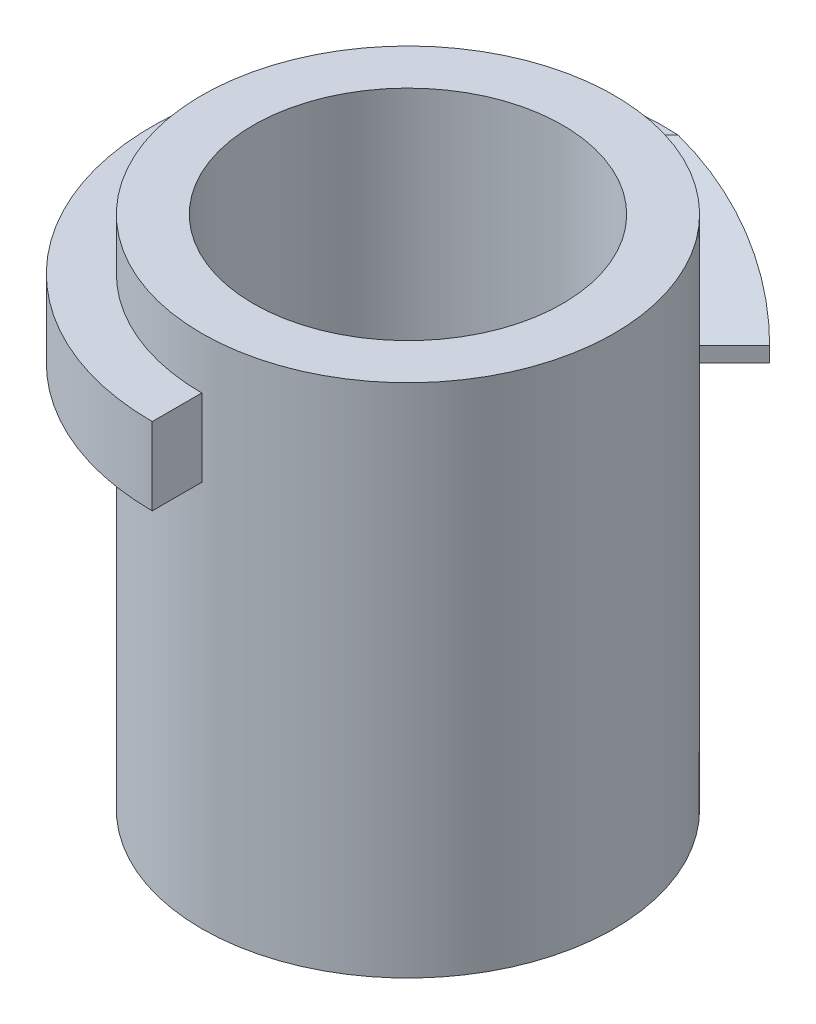
ISO-10303-21;
HEADER;
FILE_DESCRIPTION(('STEP AP214'),'2;1');
FILE_NAME('part.step','',(''),(''),'','','');
FILE_SCHEMA(('AUTOMOTIVE_DESIGN { 1 0 10303 214 1 1 1 1 }'));
ENDSEC;
DATA;
#1=APPLICATION_CONTEXT('core data for automotive mechanical design processes');
#2=APPLICATION_PROTOCOL_DEFINITION('international standard','automotive_design',2000,#1);
#3=PRODUCT_CONTEXT('',#1,'mechanical');
#4=PRODUCT('Part','Part','',(#3));
#5=PRODUCT_RELATED_PRODUCT_CATEGORY('part','',(#4));
#6=PRODUCT_DEFINITION_FORMATION('','',#4);
#7=PRODUCT_DEFINITION_CONTEXT('part definition',#1,'design');
#8=PRODUCT_DEFINITION('design','',#6,#7);
#9=PRODUCT_DEFINITION_SHAPE('','',#8);
#10=(LENGTH_UNIT() NAMED_UNIT(*) SI_UNIT(.MILLI.,.METRE.));
#11=(NAMED_UNIT(*) PLANE_ANGLE_UNIT() SI_UNIT($,.RADIAN.));
#12=(NAMED_UNIT(*) SI_UNIT($,.STERADIAN.) SOLID_ANGLE_UNIT());
#13=UNCERTAINTY_MEASURE_WITH_UNIT(LENGTH_MEASURE(1.E-05),#10,'distance_accuracy_value','');
#14=(GEOMETRIC_REPRESENTATION_CONTEXT(3) GLOBAL_UNCERTAINTY_ASSIGNED_CONTEXT((#13)) GLOBAL_UNIT_ASSIGNED_CONTEXT((#10,
#11,#12)) REPRESENTATION_CONTEXT('',''));
#15=CARTESIAN_POINT('',(0.,0.,0.));
#16=DIRECTION('',(0.,0.,1.));
#17=DIRECTION('',(1.,0.,0.));
#18=AXIS2_PLACEMENT_3D('',#15,#16,#17);
#19=CARTESIAN_POINT('',(0.,19.05,0.));
#20=DIRECTION('',(0.,1.,0.));
#21=DIRECTION('',(0.,0.,1.));
#22=AXIS2_PLACEMENT_3D('',#19,#20,#21);
#23=CYLINDRICAL_SURFACE('',#22,12.5992487894361);
#24=CARTESIAN_POINT('',(0.,22.86,0.));
#25=DIRECTION('',(0.,1.,0.));
#26=DIRECTION('',(0.,0.,1.));
#27=AXIS2_PLACEMENT_3D('',#24,#25,#26);
#28=CIRCLE('',#27,12.5992487894361);
#29=CARTESIAN_POINT('',(0.734742354814843,22.86,-12.5778067933224));
#30=VERTEX_POINT('',#29);
#31=CARTESIAN_POINT('',(0.,22.86,12.5992487894361));
#32=VERTEX_POINT('',#31);
#33=EDGE_CURVE('E100',#30,#32,#28,.T.);
#34=ORIENTED_EDGE('',*,*,#33,.F.);
#35=CARTESIAN_POINT('',(0.,19.8119999999999,0.));
#36=DIRECTION('',(-0.241844762647973,-0.93969262078591,-0.241844762647972));
#37=DIRECTION('',(-0.664463024388677,0.342020143325665,-0.664463024388675));
#38=AXIS2_PLACEMENT_3D('',#35,#36,#37);
#39=ELLIPSE('',#38,13.4078405116119,12.5992487894361);
#40=CARTESIAN_POINT('',(8.90901425686665,19.8119999999999,-8.90901425686667));
#41=VERTEX_POINT('',#40);
#42=EDGE_CURVE('E64',#30,#41,#39,.T.);
#43=ORIENTED_EDGE('',*,*,#42,.T.);
#44=DIRECTION('',(0.,1.,0.));
#45=VECTOR('',#44,1.);
#46=CARTESIAN_POINT('',(8.90901425686665,18.034,-8.90901425686667));
#47=LINE('',#46,#45);
#48=CARTESIAN_POINT('',(8.90901425686665,19.05,-8.90901425686667));
#49=VERTEX_POINT('',#48);
#50=EDGE_CURVE('E117',#49,#41,#47,.T.);
#51=ORIENTED_EDGE('',*,*,#50,.F.);
#52=CARTESIAN_POINT('',(0.,19.05,0.));
#53=DIRECTION('',(0.,1.,0.));
#54=DIRECTION('',(0.,0.,1.));
#55=AXIS2_PLACEMENT_3D('',#52,#53,#54);
#56=CIRCLE('',#55,12.5992487894361);
#57=CARTESIAN_POINT('',(0.,19.05,12.5992487894361));
#58=VERTEX_POINT('',#57);
#59=EDGE_CURVE('E129',#49,#58,#56,.T.);
#60=ORIENTED_EDGE('',*,*,#59,.T.);
#61=DIRECTION('',(0.,1.,0.));
#62=VECTOR('',#61,1.);
#63=CARTESIAN_POINT('',(0.,18.034,12.5992487894361));
#64=LINE('',#63,#62);
#65=EDGE_CURVE('E110',#58,#32,#64,.T.);
#66=ORIENTED_EDGE('',*,*,#65,.T.);
#67=EDGE_LOOP('',(#34,#43,#51,#60,#66));
#68=FACE_BOUND('',#67,.T.);
#69=ADVANCED_FACE('F41',(#68),#23,.T.);
#70=CARTESIAN_POINT('',(0.,19.05,0.));
#71=DIRECTION('',(0.,1.,0.));
#72=DIRECTION('',(0.,0.,1.));
#73=AXIS2_PLACEMENT_3D('',#70,#71,#72);
#74=PLANE('',#73);
#75=DIRECTION('',(0.707106781186546,0.,-0.707106781186549));
#76=VECTOR('',#75,1.);
#77=CARTESIAN_POINT('',(0.,19.05,0.));
#78=LINE('',#77,#76);
#79=CARTESIAN_POINT('',(7.18420489685531,19.05,-7.18420489685534));
#80=VERTEX_POINT('',#79);
#81=EDGE_CURVE('E121',#80,#49,#78,.T.);
#82=ORIENTED_EDGE('',*,*,#81,.F.);
#83=CARTESIAN_POINT('',(0.,19.05,0.));
#84=DIRECTION('',(0.,1.,0.));
#85=DIRECTION('',(0.,0.,1.));
#86=AXIS2_PLACEMENT_3D('',#83,#84,#85);
#87=CIRCLE('',#86,10.16);
#88=CARTESIAN_POINT('',(0.,19.05,10.16));
#89=VERTEX_POINT('',#88);
#90=EDGE_CURVE('E133',#80,#89,#87,.T.);
#91=ORIENTED_EDGE('',*,*,#90,.T.);
#92=DIRECTION('',(0.,0.,1.));
#93=VECTOR('',#92,1.);
#94=CARTESIAN_POINT('',(0.,19.05,0.));
#95=LINE('',#94,#93);
#96=EDGE_CURVE('E109',#89,#58,#95,.T.);
#97=ORIENTED_EDGE('',*,*,#96,.T.);
#98=ORIENTED_EDGE('',*,*,#59,.F.);
#99=EDGE_LOOP('',(#82,#91,#97,#98));
#100=FACE_BOUND('',#99,.T.);
#101=ADVANCED_FACE('F158',(#100),#74,.F.);
#102=CARTESIAN_POINT('',(0.,22.86,0.));
#103=DIRECTION('',(0.,1.,0.));
#104=DIRECTION('',(0.,0.,1.));
#105=AXIS2_PLACEMENT_3D('',#102,#103,#104);
#106=PLANE('',#105);
#107=CARTESIAN_POINT('',(0.,22.86,0.));
#108=DIRECTION('',(0.,1.,0.));
#109=DIRECTION('',(0.,0.,1.));
#110=AXIS2_PLACEMENT_3D('',#107,#108,#109);
#111=CIRCLE('',#110,10.16);
#112=CARTESIAN_POINT('',(-1.85357742890284,22.86,-9.98948700960475));
#113=VERTEX_POINT('',#112);
#114=CARTESIAN_POINT('',(0.,22.86,10.16));
#115=VERTEX_POINT('',#114);
#116=EDGE_CURVE('E88',#113,#115,#111,.T.);
#117=ORIENTED_EDGE('',*,*,#116,.F.);
#118=DIRECTION('',(0.707106781186546,0.,-0.707106781186549));
#119=VECTOR('',#118,1.);
#120=CARTESIAN_POINT('',(-5.92153221925379,22.86,-5.92153221925377));
#121=LINE('',#120,#119);
#122=EDGE_CURVE('E135',#113,#30,#121,.T.);
#123=ORIENTED_EDGE('',*,*,#122,.T.);
#124=ORIENTED_EDGE('',*,*,#33,.T.);
#125=DIRECTION('',(0.,0.,1.));
#126=VECTOR('',#125,1.);
#127=CARTESIAN_POINT('',(0.,22.86,0.));
#128=LINE('',#127,#126);
#129=EDGE_CURVE('E106',#115,#32,#128,.T.);
#130=ORIENTED_EDGE('',*,*,#129,.F.);
#131=EDGE_LOOP('',(#117,#123,#124,#130));
#132=FACE_BOUND('',#131,.T.);
#133=ADVANCED_FACE('F113',(#132),#106,.T.);
#134=CARTESIAN_POINT('',(0.,25.4,0.));
#135=DIRECTION('',(0.,-1.,0.));
#136=DIRECTION('',(0.,0.,-1.));
#137=AXIS2_PLACEMENT_3D('',#134,#135,#136);
#138=CYLINDRICAL_SURFACE('',#137,10.16);
#139=ORIENTED_EDGE('',*,*,#90,.F.);
#140=DIRECTION('',(0.,1.,0.));
#141=VECTOR('',#140,1.);
#142=CARTESIAN_POINT('',(7.18420489685531,18.034,-7.18420489685534));
#143=LINE('',#142,#141);
#144=CARTESIAN_POINT('',(7.18420489685531,19.8119999999999,-7.18420489685534));
#145=VERTEX_POINT('',#144);
#146=EDGE_CURVE('E111',#80,#145,#143,.T.);
#147=ORIENTED_EDGE('',*,*,#146,.T.);
#148=CARTESIAN_POINT('',(0.,19.8119999999999,0.));
#149=DIRECTION('',(-0.241844762647973,-0.93969262078591,-0.241844762647972));
#150=DIRECTION('',(0.664463024388677,-0.342020143325665,0.664463024388675));
#151=AXIS2_PLACEMENT_3D('',#148,#149,#150);
#152=ELLIPSE('',#151,10.8120461683553,10.16);
#153=EDGE_CURVE('E11',#145,#113,#152,.F.);
#154=ORIENTED_EDGE('',*,*,#153,.T.);
#155=ORIENTED_EDGE('',*,*,#116,.T.);
#156=DIRECTION('',(0.,1.,0.));
#157=VECTOR('',#156,1.);
#158=CARTESIAN_POINT('',(0.,18.034,10.16));
#159=LINE('',#158,#157);
#160=EDGE_CURVE('E93',#89,#115,#159,.T.);
#161=ORIENTED_EDGE('',*,*,#160,.F.);
#162=EDGE_LOOP('',(#139,#147,#154,#155,#161));
#163=FACE_BOUND('',#162,.T.);
#164=CARTESIAN_POINT('',(0.,25.4,0.));
#165=DIRECTION('',(0.,1.,0.));
#166=DIRECTION('',(0.,0.,1.));
#167=AXIS2_PLACEMENT_3D('',#164,#165,#166);
#168=CIRCLE('',#167,10.16);
#169=CARTESIAN_POINT('',(0.,25.4,10.16));
#170=VERTEX_POINT('',#169);
#171=EDGE_CURVE('E101',#170,#170,#168,.T.);
#172=ORIENTED_EDGE('',*,*,#171,.F.);
#173=EDGE_LOOP('',(#172));
#174=FACE_BOUND('',#173,.T.);
#175=CARTESIAN_POINT('',(0.,0.,0.));
#176=DIRECTION('',(0.,1.,0.));
#177=DIRECTION('',(0.,0.,1.));
#178=AXIS2_PLACEMENT_3D('',#175,#176,#177);
#179=CIRCLE('',#178,10.16);
#180=CARTESIAN_POINT('',(0.,0.,10.16));
#181=VERTEX_POINT('',#180);
#182=EDGE_CURVE('E139',#181,#181,#179,.T.);
#183=ORIENTED_EDGE('',*,*,#182,.T.);
#184=EDGE_LOOP('',(#183));
#185=FACE_BOUND('',#184,.T.);
#186=ADVANCED_FACE('F91',(#163,#174,#185),#138,.T.);
#187=CARTESIAN_POINT('',(0.,0.,0.));
#188=DIRECTION('',(0.,1.,0.));
#189=DIRECTION('',(0.,0.,1.));
#190=AXIS2_PLACEMENT_3D('',#187,#188,#189);
#191=PLANE('',#190);
#192=CARTESIAN_POINT('',(0.,0.,0.));
#193=DIRECTION('',(0.,1.,0.));
#194=DIRECTION('',(0.,0.,1.));
#195=AXIS2_PLACEMENT_3D('',#192,#193,#194);
#196=CIRCLE('',#195,1.27000000000001);
#197=CARTESIAN_POINT('',(0.,0.,1.27000000000001));
#198=VERTEX_POINT('',#197);
#199=EDGE_CURVE('E145',#198,#198,#196,.T.);
#200=ORIENTED_EDGE('',*,*,#199,.T.);
#201=EDGE_LOOP('',(#200));
#202=FACE_BOUND('',#201,.T.);
#203=ORIENTED_EDGE('',*,*,#182,.F.);
#204=EDGE_LOOP('',(#203));
#205=FACE_BOUND('',#204,.T.);
#206=ADVANCED_FACE('F181',(#202,#205),#191,.F.);
#207=CARTESIAN_POINT('',(0.,3.048,0.));
#208=DIRECTION('',(0.,-1.,0.));
#209=DIRECTION('',(0.,0.,-1.));
#210=AXIS2_PLACEMENT_3D('',#207,#208,#209);
#211=CYLINDRICAL_SURFACE('',#210,0.889);
#212=CARTESIAN_POINT('',(0.,2.8321,0.));
#213=DIRECTION('',(0.,-1.,0.));
#214=DIRECTION('',(0.,0.,-1.));
#215=AXIS2_PLACEMENT_3D('',#212,#213,#214);
#216=CIRCLE('',#215,0.889);
#217=CARTESIAN_POINT('',(0.,2.8321,-0.889));
#218=VERTEX_POINT('',#217);
#219=EDGE_CURVE('E136',#218,#218,#216,.F.);
#220=CARTESIAN_POINT('',(0.,0.381000000000014,0.));
#221=DIRECTION('',(0.,1.,0.));
#222=DIRECTION('',(0.,0.,1.));
#223=AXIS2_PLACEMENT_3D('',#220,#221,#222);
#224=CIRCLE('',#223,0.889);
#225=CARTESIAN_POINT('',(0.,0.381000000000013,-0.889));
#226=VERTEX_POINT('',#225);
#227=EDGE_CURVE('E142',#226,#226,#224,.F.);
#228=CARTESIAN_POINT('',(0.,2.8321,-0.889));
#229=CARTESIAN_POINT('',(0.,2.80656770833334,-0.889));
#230=CARTESIAN_POINT('',(0.,2.78103541666667,-0.889));
#231=CARTESIAN_POINT('',(0.,2.72997083333334,-0.889));
#232=CARTESIAN_POINT('',(0.,2.70443854166667,-0.889));
#233=CARTESIAN_POINT('',(0.,2.65337395833334,-0.889));
#234=CARTESIAN_POINT('',(0.,2.62784166666667,-0.889));
#235=CARTESIAN_POINT('',(0.,2.57677708333334,-0.889));
#236=CARTESIAN_POINT('',(0.,2.55124479166667,-0.889));
#237=CARTESIAN_POINT('',(0.,2.50018020833334,-0.889));
#238=CARTESIAN_POINT('',(0.,2.47464791666667,-0.889));
#239=CARTESIAN_POINT('',(0.,2.42358333333334,-0.889));
#240=CARTESIAN_POINT('',(0.,2.39805104166667,-0.889));
#241=CARTESIAN_POINT('',(0.,2.34698645833334,-0.889));
#242=CARTESIAN_POINT('',(0.,2.32145416666667,-0.889));
#243=CARTESIAN_POINT('',(0.,2.27038958333334,-0.889));
#244=CARTESIAN_POINT('',(0.,2.24485729166667,-0.889));
#245=CARTESIAN_POINT('',(0.,2.19379270833334,-0.889));
#246=CARTESIAN_POINT('',(0.,2.16826041666667,-0.889));
#247=CARTESIAN_POINT('',(0.,2.11719583333334,-0.889));
#248=CARTESIAN_POINT('',(0.,2.09166354166667,-0.889));
#249=CARTESIAN_POINT('',(0.,2.04059895833334,-0.889));
#250=CARTESIAN_POINT('',(0.,2.01506666666667,-0.889));
#251=CARTESIAN_POINT('',(0.,1.96400208333334,-0.889));
#252=CARTESIAN_POINT('',(0.,1.93846979166667,-0.889));
#253=CARTESIAN_POINT('',(0.,1.88740520833334,-0.889));
#254=CARTESIAN_POINT('',(0.,1.86187291666667,-0.889));
#255=CARTESIAN_POINT('',(0.,1.81080833333334,-0.889));
#256=CARTESIAN_POINT('',(0.,1.78527604166667,-0.889));
#257=CARTESIAN_POINT('',(0.,1.73421145833334,-0.889));
#258=CARTESIAN_POINT('',(0.,1.70867916666667,-0.889));
#259=CARTESIAN_POINT('',(0.,1.65761458333334,-0.889));
#260=CARTESIAN_POINT('',(0.,1.63208229166667,-0.889));
#261=CARTESIAN_POINT('',(0.,1.58101770833334,-0.889));
#262=CARTESIAN_POINT('',(0.,1.55548541666667,-0.889));
#263=CARTESIAN_POINT('',(0.,1.50442083333334,-0.889));
#264=CARTESIAN_POINT('',(0.,1.47888854166667,-0.889));
#265=CARTESIAN_POINT('',(0.,1.42782395833334,-0.889));
#266=CARTESIAN_POINT('',(0.,1.40229166666667,-0.889));
#267=CARTESIAN_POINT('',(0.,1.35122708333334,-0.889));
#268=CARTESIAN_POINT('',(0.,1.32569479166668,-0.889));
#269=CARTESIAN_POINT('',(0.,1.27463020833334,-0.889));
#270=CARTESIAN_POINT('',(0.,1.24909791666668,-0.889));
#271=CARTESIAN_POINT('',(0.,1.19803333333334,-0.889));
#272=CARTESIAN_POINT('',(0.,1.17250104166668,-0.889));
#273=CARTESIAN_POINT('',(0.,1.12143645833334,-0.889));
#274=CARTESIAN_POINT('',(0.,1.09590416666668,-0.889));
#275=CARTESIAN_POINT('',(0.,1.04483958333334,-0.889));
#276=CARTESIAN_POINT('',(0.,1.01930729166668,-0.889));
#277=CARTESIAN_POINT('',(0.,0.968242708333344,-0.889));
#278=CARTESIAN_POINT('',(0.,0.942710416666677,-0.889));
#279=CARTESIAN_POINT('',(0.,0.891645833333344,-0.889));
#280=CARTESIAN_POINT('',(0.,0.866113541666678,-0.889));
#281=CARTESIAN_POINT('',(0.,0.815048958333345,-0.889));
#282=CARTESIAN_POINT('',(0.,0.789516666666678,-0.889));
#283=CARTESIAN_POINT('',(0.,0.738452083333345,-0.889));
#284=CARTESIAN_POINT('',(0.,0.712919791666679,-0.889));
#285=CARTESIAN_POINT('',(0.,0.661855208333345,-0.889));
#286=CARTESIAN_POINT('',(0.,0.636322916666679,-0.889));
#287=CARTESIAN_POINT('',(0.,0.585258333333345,-0.889));
#288=CARTESIAN_POINT('',(0.,0.559726041666679,-0.889));
#289=CARTESIAN_POINT('',(0.,0.508661458333346,-0.889));
#290=CARTESIAN_POINT('',(0.,0.483129166666679,-0.889));
#291=CARTESIAN_POINT('',(0.,0.432064583333346,-0.889));
#292=CARTESIAN_POINT('',(0.,0.40653229166668,-0.889));
#293=CARTESIAN_POINT('',(0.,0.381000000000013,-0.889));
#294=B_SPLINE_CURVE_WITH_KNOTS('',3,(#228,#229,#230,#231,#232,#233,#234,#235,#236,#237,#238,
#239,#240,#241,#242,#243,#244,#245,#246,#247,#248,#249,#250,#251,#252,#253,#254,#255,#256,#257,
#258,#259,#260,#261,#262,#263,#264,#265,#266,#267,#268,#269,#270,#271,#272,#273,#274,#275,#276,
#277,#278,#279,#280,#281,#282,#283,#284,#285,#286,#287,#288,#289,#290,#291,#292,#293),
.UNSPECIFIED.,.F.,.F.,(4,2,2,2,2,2,2,2,2,2,2,2,2,2,2,2,2,2,2,2,2,2,2,2,2,2,2,2,2,2,2,2,4),(0.,
0.0765968749999999,0.153193749999999,0.229790624999999,0.306387499999999,0.382984374999998,
0.459581249999998,0.536178124999998,0.612774999999997,0.689371874999997,0.765968749999996,
0.842565624999996,0.919162499999996,0.995759374999996,1.07235625,1.14895312499999,
1.22554999999999,1.30214687499999,1.37874374999999,1.45534062499999,1.53193749999999,
1.60853437499999,1.68513124999999,1.76172812499999,1.83832499999999,1.91492187499999,
1.99151874999999,2.06811562499999,2.14471249999999,2.22130937499999,2.29790624999999,
2.37450312499999,2.45109999999999),.UNSPECIFIED.);
#295=EDGE_CURVE('BSEAM177',#218,#226,#294,.T.);
#296=ORIENTED_EDGE('',*,*,#219,.T.);
#297=ORIENTED_EDGE('',*,*,#227,.T.);
#298=ORIENTED_EDGE('',*,*,#295,.T.);
#299=ORIENTED_EDGE('',*,*,#295,.F.);
#300=EDGE_LOOP('',(#296,#298,#297,#299));
#301=FACE_BOUND('',#300,.T.);
#302=ADVANCED_FACE('F177',(#301),#211,.F.);
#303=CARTESIAN_POINT('',(0.,3.048,0.));
#304=DIRECTION('',(0.,-1.,0.));
#305=DIRECTION('',(0.,0.,-1.));
#306=AXIS2_PLACEMENT_3D('',#303,#304,#305);
#307=PLANE('',#306);
#308=CARTESIAN_POINT('',(0.,3.048,0.));
#309=DIRECTION('',(0.,-1.,0.));
#310=DIRECTION('',(0.,0.,-1.));
#311=AXIS2_PLACEMENT_3D('',#308,#309,#310);
#312=CIRCLE('',#311,0.0832502306458635);
#313=CARTESIAN_POINT('',(0.,3.048,-0.0832502306458627));
#314=VERTEX_POINT('',#313);
#315=EDGE_CURVE('E148',#314,#314,#312,.T.);
#316=ORIENTED_EDGE('',*,*,#315,.T.);
#317=EDGE_LOOP('',(#316));
#318=FACE_BOUND('',#317,.T.);
#319=ADVANCED_FACE('F173',(#318),#307,.T.);
#320=CARTESIAN_POINT('',(0.,0.381000000000014,0.));
#321=DIRECTION('',(0.,-1.,0.));
#322=DIRECTION('',(0.,0.,-1.));
#323=AXIS2_PLACEMENT_3D('',#320,#321,#322);
#324=CONICAL_SURFACE('',#323,0.889,0.785398163397449);
#325=ORIENTED_EDGE('',*,*,#199,.F.);
#326=EDGE_LOOP('',(#325));
#327=FACE_BOUND('',#326,.T.);
#328=ORIENTED_EDGE('',*,*,#227,.F.);
#329=EDGE_LOOP('',(#328));
#330=FACE_BOUND('',#329,.T.);
#331=ADVANCED_FACE('F176',(#327,#330),#324,.F.);
#332=CARTESIAN_POINT('',(0.,3.048,0.));
#333=DIRECTION('',(0.,-1.,0.));
#334=DIRECTION('',(0.,0.,-1.));
#335=AXIS2_PLACEMENT_3D('',#332,#333,#334);
#336=CONICAL_SURFACE('',#335,0.0832502306458635,1.30899693899575);
#337=CARTESIAN_POINT('',(0.,2.8321,-0.888999999999999));
#338=CARTESIAN_POINT('',(0.,2.83434895833333,-0.880606773235894));
#339=CARTESIAN_POINT('',(0.,2.83659791666667,-0.872213546471788));
#340=CARTESIAN_POINT('',(0.,2.84109583333333,-0.855427092943577));
#341=CARTESIAN_POINT('',(0.,2.84334479166667,-0.847033866179471));
#342=CARTESIAN_POINT('',(0.,2.84784270833334,-0.83024741265126));
#343=CARTESIAN_POINT('',(0.,2.85009166666667,-0.821854185887154));
#344=CARTESIAN_POINT('',(0.,2.85458958333334,-0.805067732358943));
#345=CARTESIAN_POINT('',(0.,2.85683854166667,-0.796674505594838));
#346=CARTESIAN_POINT('',(0.,2.86133645833333,-0.779888052066627));
#347=CARTESIAN_POINT('',(0.,2.86358541666667,-0.771494825302521));
#348=CARTESIAN_POINT('',(0.,2.86808333333334,-0.75470837177431));
#349=CARTESIAN_POINT('',(0.,2.87033229166667,-0.746315145010204));
#350=CARTESIAN_POINT('',(0.,2.87483020833333,-0.729528691481993));
#351=CARTESIAN_POINT('',(0.,2.87707916666667,-0.721135464717887));
#352=CARTESIAN_POINT('',(0.,2.88157708333333,-0.704349011189676));
#353=CARTESIAN_POINT('',(0.,2.88382604166667,-0.695955784425571));
#354=CARTESIAN_POINT('',(0.,2.88832395833333,-0.67916933089736));
#355=CARTESIAN_POINT('',(0.,2.89057291666667,-0.670776104133254));
#356=CARTESIAN_POINT('',(0.,2.89507083333333,-0.653989650605043));
#357=CARTESIAN_POINT('',(0.,2.89731979166667,-0.645596423840937));
#358=CARTESIAN_POINT('',(0.,2.90181770833333,-0.628809970312726));
#359=CARTESIAN_POINT('',(0.,2.90406666666667,-0.62041674354862));
#360=CARTESIAN_POINT('',(0.,2.90856458333333,-0.603630290020409));
#361=CARTESIAN_POINT('',(0.,2.91081354166667,-0.595237063256304));
#362=CARTESIAN_POINT('',(0.,2.91531145833333,-0.578450609728092));
#363=CARTESIAN_POINT('',(0.,2.91756041666667,-0.570057382963987));
#364=CARTESIAN_POINT('',(0.,2.92205833333333,-0.553270929435776));
#365=CARTESIAN_POINT('',(0.,2.92430729166667,-0.54487770267167));
#366=CARTESIAN_POINT('',(0.,2.92880520833333,-0.528091249143459));
#367=CARTESIAN_POINT('',(0.,2.93105416666667,-0.519698022379353));
#368=CARTESIAN_POINT('',(0.,2.93555208333333,-0.502911568851142));
#369=CARTESIAN_POINT('',(0.,2.93780104166667,-0.494518342087037));
#370=CARTESIAN_POINT('',(0.,2.94229895833333,-0.477731888558825));
#371=CARTESIAN_POINT('',(0.,2.94454791666667,-0.46933866179472));
#372=CARTESIAN_POINT('',(0.,2.94904583333333,-0.452552208266509));
#373=CARTESIAN_POINT('',(0.,2.95129479166667,-0.444158981502403));
#374=CARTESIAN_POINT('',(0.,2.95579270833333,-0.427372527974192));
#375=CARTESIAN_POINT('',(0.,2.95804166666667,-0.418979301210086));
#376=CARTESIAN_POINT('',(0.,2.96253958333333,-0.402192847681875));
#377=CARTESIAN_POINT('',(0.,2.96478854166667,-0.393799620917769));
#378=CARTESIAN_POINT('',(0.,2.96928645833333,-0.377013167389558));
#379=CARTESIAN_POINT('',(0.,2.97153541666667,-0.368619940625453));
#380=CARTESIAN_POINT('',(0.,2.97603333333333,-0.351833487097242));
#381=CARTESIAN_POINT('',(0.,2.97828229166667,-0.343440260333136));
#382=CARTESIAN_POINT('',(0.,2.98278020833333,-0.326653806804925));
#383=CARTESIAN_POINT('',(0.,2.98502916666667,-0.318260580040819));
#384=CARTESIAN_POINT('',(0.,2.98952708333333,-0.301474126512608));
#385=CARTESIAN_POINT('',(0.,2.99177604166667,-0.293080899748502));
#386=CARTESIAN_POINT('',(0.,2.99627395833333,-0.276294446220291));
#387=CARTESIAN_POINT('',(0.,2.99852291666667,-0.267901219456186));
#388=CARTESIAN_POINT('',(0.,3.00302083333333,-0.251114765927974));
#389=CARTESIAN_POINT('',(0.,3.00526979166667,-0.242721539163869));
#390=CARTESIAN_POINT('',(0.,3.00976770833333,-0.225935085635658));
#391=CARTESIAN_POINT('',(0.,3.01201666666667,-0.217541858871552));
#392=CARTESIAN_POINT('',(0.,3.01651458333333,-0.200755405343341));
#393=CARTESIAN_POINT('',(0.,3.01876354166667,-0.192362178579235));
#394=CARTESIAN_POINT('',(0.,3.02326145833333,-0.175575725051024));
#395=CARTESIAN_POINT('',(0.,3.02551041666667,-0.167182498286919));
#396=CARTESIAN_POINT('',(0.,3.03000833333333,-0.150396044758707));
#397=CARTESIAN_POINT('',(0.,3.03225729166667,-0.142002817994602));
#398=CARTESIAN_POINT('',(0.,3.03675520833333,-0.125216364466391));
#399=CARTESIAN_POINT('',(0.,3.03900416666667,-0.116823137702285));
#400=CARTESIAN_POINT('',(0.,3.04350208333333,-0.100036684174074));
#401=CARTESIAN_POINT('',(0.,3.04575104166667,-0.0916434574099683));
#402=CARTESIAN_POINT('',(0.,3.048,-0.0832502306458627));
#403=B_SPLINE_CURVE_WITH_KNOTS('',3,(#337,#338,#339,#340,#341,#342,#343,#344,#345,#346,#347,
#348,#349,#350,#351,#352,#353,#354,#355,#356,#357,#358,#359,#360,#361,#362,#363,#364,#365,#366,
#367,#368,#369,#370,#371,#372,#373,#374,#375,#376,#377,#378,#379,#380,#381,#382,#383,#384,#385,
#386,#387,#388,#389,#390,#391,#392,#393,#394,#395,#396,#397,#398,#399,#400,#401,#402),
.UNSPECIFIED.,.F.,.F.,(4,2,2,2,2,2,2,2,2,2,2,2,2,2,2,2,2,2,2,2,2,2,2,2,2,2,2,2,2,2,2,2,4),(0.,
0.0260679232369767,0.0521358464739536,0.0782037697109302,0.104271692947907,0.130339616184883,
0.15640753942186,0.182475462658837,0.208543385895814,0.23461130913279,0.260679232369767,
0.286747155606744,0.312815078843721,0.338883002080697,0.364950925317674,0.391018848554651,
0.417086771791627,0.443154695028604,0.469222618265581,0.495290541502557,0.521358464739534,
0.547426387976511,0.573494311213487,0.599562234450464,0.625630157687441,0.651698080924417,
0.677766004161394,0.703833927398371,0.729901850635347,0.755969773872324,0.782037697109301,
0.808105620346278,0.834173543583254),.UNSPECIFIED.);
#404=EDGE_CURVE('BSEAM187',#218,#314,#403,.T.);
#405=ORIENTED_EDGE('',*,*,#219,.F.);
#406=ORIENTED_EDGE('',*,*,#315,.F.);
#407=ORIENTED_EDGE('',*,*,#404,.T.);
#408=ORIENTED_EDGE('',*,*,#404,.F.);
#409=EDGE_LOOP('',(#405,#407,#406,#408));
#410=FACE_BOUND('',#409,.T.);
#411=ADVANCED_FACE('F187',(#410),#336,.F.);
#412=CARTESIAN_POINT('',(0.,5.08,0.));
#413=DIRECTION('',(0.,1.,0.));
#414=DIRECTION('',(0.,0.,1.));
#415=AXIS2_PLACEMENT_3D('',#412,#413,#414);
#416=PLANE('',#415);
#417=CARTESIAN_POINT('',(0.,5.08,0.));
#418=DIRECTION('',(0.,1.,0.));
#419=DIRECTION('',(0.,0.,1.));
#420=AXIS2_PLACEMENT_3D('',#417,#418,#419);
#421=CIRCLE('',#420,7.62);
#422=CARTESIAN_POINT('',(0.,5.08,7.62));
#423=VERTEX_POINT('',#422);
#424=EDGE_CURVE('E132',#423,#423,#421,.T.);
#425=ORIENTED_EDGE('',*,*,#424,.T.);
#426=EDGE_LOOP('',(#425));
#427=FACE_BOUND('',#426,.T.);
#428=ADVANCED_FACE('F183',(#427),#416,.T.);
#429=CARTESIAN_POINT('',(0.,5.08,0.));
#430=DIRECTION('',(0.,1.,0.));
#431=DIRECTION('',(0.,0.,1.));
#432=AXIS2_PLACEMENT_3D('',#429,#430,#431);
#433=CYLINDRICAL_SURFACE('',#432,7.62);
#434=ORIENTED_EDGE('',*,*,#424,.F.);
#435=EDGE_LOOP('',(#434));
#436=FACE_BOUND('',#435,.T.);
#437=CARTESIAN_POINT('',(0.,25.4,0.));
#438=DIRECTION('',(0.,1.,0.));
#439=DIRECTION('',(0.,0.,1.));
#440=AXIS2_PLACEMENT_3D('',#437,#438,#439);
#441=CIRCLE('',#440,7.62);
#442=CARTESIAN_POINT('',(0.,25.4,7.62));
#443=VERTEX_POINT('',#442);
#444=EDGE_CURVE('E126',#443,#443,#441,.T.);
#445=ORIENTED_EDGE('',*,*,#444,.T.);
#446=EDGE_LOOP('',(#445));
#447=FACE_BOUND('',#446,.T.);
#448=ADVANCED_FACE('F186',(#436,#447),#433,.F.);
#449=CARTESIAN_POINT('',(0.,25.4,0.));
#450=DIRECTION('',(0.,1.,0.));
#451=DIRECTION('',(0.,0.,1.));
#452=AXIS2_PLACEMENT_3D('',#449,#450,#451);
#453=PLANE('',#452);
#454=ORIENTED_EDGE('',*,*,#444,.F.);
#455=EDGE_LOOP('',(#454));
#456=FACE_BOUND('',#455,.T.);
#457=ORIENTED_EDGE('',*,*,#171,.T.);
#458=EDGE_LOOP('',(#457));
#459=FACE_BOUND('',#458,.T.);
#460=ADVANCED_FACE('F191',(#456,#459),#453,.T.);
#461=CARTESIAN_POINT('',(0.,18.034,0.));
#462=DIRECTION('',(0.707106781186549,0.,0.707106781186546));
#463=DIRECTION('',(0.707106781186546,0.,-0.707106781186549));
#464=AXIS2_PLACEMENT_3D('',#461,#462,#463);
#465=PLANE('',#464);
#466=ORIENTED_EDGE('',*,*,#50,.T.);
#467=DIRECTION('',(-0.707106781186546,0.,0.707106781186549));
#468=VECTOR('',#467,1.);
#469=CARTESIAN_POINT('',(0.,19.8119999999999,0.));
#470=LINE('',#469,#468);
#471=EDGE_CURVE('E50',#41,#145,#470,.T.);
#472=ORIENTED_EDGE('',*,*,#471,.T.);
#473=ORIENTED_EDGE('',*,*,#146,.F.);
#474=ORIENTED_EDGE('',*,*,#81,.T.);
#475=EDGE_LOOP('',(#466,#472,#473,#474));
#476=FACE_BOUND('',#475,.T.);
#477=ADVANCED_FACE('F163',(#476),#465,.T.);
#478=CARTESIAN_POINT('',(0.,18.034,0.));
#479=DIRECTION('',(-1.,0.,0.));
#480=DIRECTION('',(0.,0.,1.));
#481=AXIS2_PLACEMENT_3D('',#478,#479,#480);
#482=PLANE('',#481);
#483=ORIENTED_EDGE('',*,*,#160,.T.);
#484=ORIENTED_EDGE('',*,*,#129,.T.);
#485=ORIENTED_EDGE('',*,*,#65,.F.);
#486=ORIENTED_EDGE('',*,*,#96,.F.);
#487=EDGE_LOOP('',(#483,#484,#485,#486));
#488=FACE_BOUND('',#487,.T.);
#489=ADVANCED_FACE('F105',(#488),#482,.F.);
#490=CARTESIAN_POINT('',(-5.92153221925379,22.86,-5.92153221925377));
#491=DIRECTION('',(-0.241844762647973,-0.93969262078591,-0.241844762647972));
#492=DIRECTION('',(0.707106781186546,0.,-0.707106781186549));
#493=AXIS2_PLACEMENT_3D('',#490,#491,#492);
#494=PLANE('',#493);
#495=ORIENTED_EDGE('',*,*,#153,.F.);
#496=ORIENTED_EDGE('',*,*,#471,.F.);
#497=ORIENTED_EDGE('',*,*,#42,.F.);
#498=ORIENTED_EDGE('',*,*,#122,.F.);
#499=EDGE_LOOP('',(#495,#496,#497,#498));
#500=FACE_BOUND('',#499,.T.);
#501=ADVANCED_FACE('F44',(#500),#494,.F.);
#502=CLOSED_SHELL('',(#69,#101,#133,#186,#206,#302,#319,#331,#411,#428,#448,#460,#477,#489,#501));
#503=MANIFOLD_SOLID_BREP('B2',#502);
#504=ADVANCED_BREP_SHAPE_REPRESENTATION('',(#18,#503),#14);
#505=SHAPE_DEFINITION_REPRESENTATION(#9,#504);
ENDSEC;
END-ISO-10303-21;
